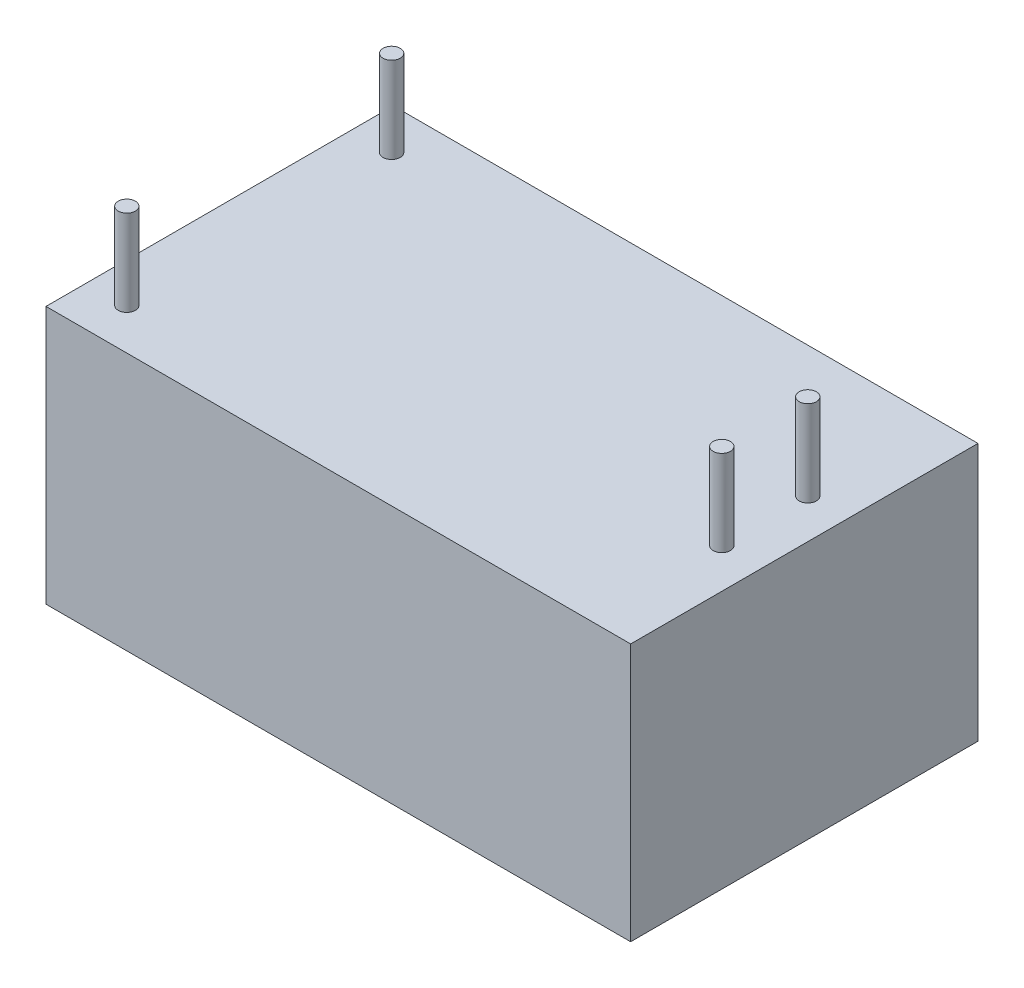
ISO-10303-21;
HEADER;
FILE_DESCRIPTION(('STEP AP214'),'2;1');
FILE_NAME('part.step','',(''),(''),'','','');
FILE_SCHEMA(('AUTOMOTIVE_DESIGN { 1 0 10303 214 1 1 1 1 }'));
ENDSEC;
DATA;
#1=APPLICATION_CONTEXT('core data for automotive mechanical design processes');
#2=APPLICATION_PROTOCOL_DEFINITION('international standard','automotive_design',2000,#1);
#3=PRODUCT_CONTEXT('',#1,'mechanical');
#4=PRODUCT('Part','Part','',(#3));
#5=PRODUCT_RELATED_PRODUCT_CATEGORY('part','',(#4));
#6=PRODUCT_DEFINITION_FORMATION('','',#4);
#7=PRODUCT_DEFINITION_CONTEXT('part definition',#1,'design');
#8=PRODUCT_DEFINITION('design','',#6,#7);
#9=PRODUCT_DEFINITION_SHAPE('','',#8);
#10=(LENGTH_UNIT() NAMED_UNIT(*) SI_UNIT(.MILLI.,.METRE.));
#11=(NAMED_UNIT(*) PLANE_ANGLE_UNIT() SI_UNIT($,.RADIAN.));
#12=(NAMED_UNIT(*) SI_UNIT($,.STERADIAN.) SOLID_ANGLE_UNIT());
#13=UNCERTAINTY_MEASURE_WITH_UNIT(LENGTH_MEASURE(1.E-05),#10,'distance_accuracy_value','');
#14=(GEOMETRIC_REPRESENTATION_CONTEXT(3) GLOBAL_UNCERTAINTY_ASSIGNED_CONTEXT((#13)) GLOBAL_UNIT_ASSIGNED_CONTEXT((#10,
#11,#12)) REPRESENTATION_CONTEXT('',''));
#15=CARTESIAN_POINT('',(0.,0.,0.));
#16=DIRECTION('',(0.,0.,1.));
#17=DIRECTION('',(1.,0.,0.));
#18=AXIS2_PLACEMENT_3D('',#15,#16,#17);
#19=CARTESIAN_POINT('',(17.,15.,10.1));
#20=DIRECTION('',(-1.,0.,0.));
#21=DIRECTION('',(0.,0.,1.));
#22=AXIS2_PLACEMENT_3D('',#19,#20,#21);
#23=PLANE('',#22);
#24=DIRECTION('',(0.,0.,-1.));
#25=VECTOR('',#24,1.);
#26=CARTESIAN_POINT('',(17.,0.,10.1));
#27=LINE('',#26,#25);
#28=CARTESIAN_POINT('',(17.,0.,10.1));
#29=VERTEX_POINT('',#28);
#30=CARTESIAN_POINT('',(17.,0.,-10.1));
#31=VERTEX_POINT('',#30);
#32=EDGE_CURVE('E101',#29,#31,#27,.T.);
#33=ORIENTED_EDGE('',*,*,#32,.T.);
#34=DIRECTION('',(0.,-1.,0.));
#35=VECTOR('',#34,1.);
#36=CARTESIAN_POINT('',(17.,15.,-10.1));
#37=LINE('',#36,#35);
#38=CARTESIAN_POINT('',(17.,15.,-10.1));
#39=VERTEX_POINT('',#38);
#40=EDGE_CURVE('E92',#39,#31,#37,.T.);
#41=ORIENTED_EDGE('',*,*,#40,.F.);
#42=DIRECTION('',(0.,0.,-1.));
#43=VECTOR('',#42,1.);
#44=CARTESIAN_POINT('',(17.,15.,10.1));
#45=LINE('',#44,#43);
#46=CARTESIAN_POINT('',(17.,15.,10.1));
#47=VERTEX_POINT('',#46);
#48=EDGE_CURVE('E86',#47,#39,#45,.T.);
#49=ORIENTED_EDGE('',*,*,#48,.F.);
#50=DIRECTION('',(0.,-1.,0.));
#51=VECTOR('',#50,1.);
#52=CARTESIAN_POINT('',(17.,15.,10.1));
#53=LINE('',#52,#51);
#54=EDGE_CURVE('E97',#47,#29,#53,.T.);
#55=ORIENTED_EDGE('',*,*,#54,.T.);
#56=EDGE_LOOP('',(#33,#41,#49,#55));
#57=FACE_BOUND('',#56,.T.);
#58=ADVANCED_FACE('F34',(#57),#23,.F.);
#59=CARTESIAN_POINT('',(-17.,15.,-10.1));
#60=DIRECTION('',(0.,0.,1.));
#61=DIRECTION('',(1.,0.,0.));
#62=AXIS2_PLACEMENT_3D('',#59,#60,#61);
#63=PLANE('',#62);
#64=DIRECTION('',(-1.,0.,0.));
#65=VECTOR('',#64,1.);
#66=CARTESIAN_POINT('',(-17.,0.,-10.1));
#67=LINE('',#66,#65);
#68=CARTESIAN_POINT('',(-17.,0.,-10.1));
#69=VERTEX_POINT('',#68);
#70=EDGE_CURVE('E91',#31,#69,#67,.T.);
#71=ORIENTED_EDGE('',*,*,#70,.T.);
#72=DIRECTION('',(0.,-1.,0.));
#73=VECTOR('',#72,1.);
#74=CARTESIAN_POINT('',(-17.,15.,-10.1));
#75=LINE('',#74,#73);
#76=CARTESIAN_POINT('',(-17.,15.,-10.1));
#77=VERTEX_POINT('',#76);
#78=EDGE_CURVE('E89',#77,#69,#75,.T.);
#79=ORIENTED_EDGE('',*,*,#78,.F.);
#80=DIRECTION('',(-1.,0.,0.));
#81=VECTOR('',#80,1.);
#82=CARTESIAN_POINT('',(-17.,15.,-10.1));
#83=LINE('',#82,#81);
#84=EDGE_CURVE('E81',#39,#77,#83,.T.);
#85=ORIENTED_EDGE('',*,*,#84,.F.);
#86=ORIENTED_EDGE('',*,*,#40,.T.);
#87=EDGE_LOOP('',(#71,#79,#85,#86));
#88=FACE_BOUND('',#87,.T.);
#89=ADVANCED_FACE('F90',(#88),#63,.F.);
#90=CARTESIAN_POINT('',(-17.,15.,10.1));
#91=DIRECTION('',(1.,0.,0.));
#92=DIRECTION('',(0.,0.,-1.));
#93=AXIS2_PLACEMENT_3D('',#90,#91,#92);
#94=PLANE('',#93);
#95=DIRECTION('',(0.,0.,1.));
#96=VECTOR('',#95,1.);
#97=CARTESIAN_POINT('',(-17.,0.,10.1));
#98=LINE('',#97,#96);
#99=CARTESIAN_POINT('',(-17.,0.,10.1));
#100=VERTEX_POINT('',#99);
#101=EDGE_CURVE('E67',#69,#100,#98,.T.);
#102=ORIENTED_EDGE('',*,*,#101,.T.);
#103=DIRECTION('',(0.,-1.,0.));
#104=VECTOR('',#103,1.);
#105=CARTESIAN_POINT('',(-17.,15.,10.1));
#106=LINE('',#105,#104);
#107=CARTESIAN_POINT('',(-17.,15.,10.1));
#108=VERTEX_POINT('',#107);
#109=EDGE_CURVE('E93',#108,#100,#106,.T.);
#110=ORIENTED_EDGE('',*,*,#109,.F.);
#111=DIRECTION('',(0.,0.,1.));
#112=VECTOR('',#111,1.);
#113=CARTESIAN_POINT('',(-17.,15.,10.1));
#114=LINE('',#113,#112);
#115=EDGE_CURVE('E84',#77,#108,#114,.T.);
#116=ORIENTED_EDGE('',*,*,#115,.F.);
#117=ORIENTED_EDGE('',*,*,#78,.T.);
#118=EDGE_LOOP('',(#102,#110,#116,#117));
#119=FACE_BOUND('',#118,.T.);
#120=ADVANCED_FACE('F95',(#119),#94,.F.);
#121=CARTESIAN_POINT('',(-17.,15.,10.1));
#122=DIRECTION('',(0.,0.,-1.));
#123=DIRECTION('',(-1.,0.,0.));
#124=AXIS2_PLACEMENT_3D('',#121,#122,#123);
#125=PLANE('',#124);
#126=DIRECTION('',(1.,0.,0.));
#127=VECTOR('',#126,1.);
#128=CARTESIAN_POINT('',(-17.,0.,10.1));
#129=LINE('',#128,#127);
#130=EDGE_CURVE('E73',#100,#29,#129,.T.);
#131=ORIENTED_EDGE('',*,*,#130,.T.);
#132=ORIENTED_EDGE('',*,*,#54,.F.);
#133=DIRECTION('',(1.,0.,0.));
#134=VECTOR('',#133,1.);
#135=CARTESIAN_POINT('',(-17.,15.,10.1));
#136=LINE('',#135,#134);
#137=EDGE_CURVE('E50',#108,#47,#136,.T.);
#138=ORIENTED_EDGE('',*,*,#137,.F.);
#139=ORIENTED_EDGE('',*,*,#109,.T.);
#140=EDGE_LOOP('',(#131,#132,#138,#139));
#141=FACE_BOUND('',#140,.T.);
#142=ADVANCED_FACE('F124',(#141),#125,.F.);
#143=CARTESIAN_POINT('',(0.,15.,0.));
#144=DIRECTION('',(0.,-1.,0.));
#145=DIRECTION('',(0.,0.,-1.));
#146=AXIS2_PLACEMENT_3D('',#143,#144,#145);
#147=PLANE('',#146);
#148=CARTESIAN_POINT('',(14.7,15.,-2.5));
#149=DIRECTION('',(0.,-1.,0.));
#150=DIRECTION('',(0.,0.,-1.));
#151=AXIS2_PLACEMENT_3D('',#148,#149,#150);
#152=CIRCLE('',#151,0.500000000000001);
#153=CARTESIAN_POINT('',(14.7,15.,-3.));
#154=VERTEX_POINT('',#153);
#155=EDGE_CURVE('E11',#154,#154,#152,.F.);
#156=ORIENTED_EDGE('',*,*,#155,.F.);
#157=EDGE_LOOP('',(#156));
#158=FACE_BOUND('',#157,.T.);
#159=CARTESIAN_POINT('',(14.7,15.,2.5));
#160=DIRECTION('',(0.,-1.,0.));
#161=DIRECTION('',(0.,0.,-1.));
#162=AXIS2_PLACEMENT_3D('',#159,#160,#161);
#163=CIRCLE('',#162,0.500000000000001);
#164=CARTESIAN_POINT('',(14.7,15.,2.));
#165=VERTEX_POINT('',#164);
#166=EDGE_CURVE('E42',#165,#165,#163,.F.);
#167=ORIENTED_EDGE('',*,*,#166,.F.);
#168=EDGE_LOOP('',(#167));
#169=FACE_BOUND('',#168,.T.);
#170=CARTESIAN_POINT('',(-14.7,15.,7.7));
#171=DIRECTION('',(0.,-1.,0.));
#172=DIRECTION('',(0.,0.,-1.));
#173=AXIS2_PLACEMENT_3D('',#170,#171,#172);
#174=CIRCLE('',#173,0.500000000000001);
#175=CARTESIAN_POINT('',(-14.7,15.,7.2));
#176=VERTEX_POINT('',#175);
#177=EDGE_CURVE('E114',#176,#176,#174,.F.);
#178=ORIENTED_EDGE('',*,*,#177,.F.);
#179=EDGE_LOOP('',(#178));
#180=FACE_BOUND('',#179,.T.);
#181=CARTESIAN_POINT('',(-14.7,15.,-7.7));
#182=DIRECTION('',(0.,-1.,0.));
#183=DIRECTION('',(0.,0.,-1.));
#184=AXIS2_PLACEMENT_3D('',#181,#182,#183);
#185=CIRCLE('',#184,0.500000000000001);
#186=CARTESIAN_POINT('',(-14.7,15.,-8.2));
#187=VERTEX_POINT('',#186);
#188=EDGE_CURVE('E111',#187,#187,#185,.F.);
#189=ORIENTED_EDGE('',*,*,#188,.F.);
#190=EDGE_LOOP('',(#189));
#191=FACE_BOUND('',#190,.T.);
#192=ORIENTED_EDGE('',*,*,#48,.T.);
#193=ORIENTED_EDGE('',*,*,#84,.T.);
#194=ORIENTED_EDGE('',*,*,#115,.T.);
#195=ORIENTED_EDGE('',*,*,#137,.T.);
#196=EDGE_LOOP('',(#192,#193,#194,#195));
#197=FACE_BOUND('',#196,.T.);
#198=ADVANCED_FACE('F82',(#158,#169,#180,#191,#197),#147,.F.);
#199=CARTESIAN_POINT('',(0.,0.,0.));
#200=DIRECTION('',(0.,-1.,0.));
#201=DIRECTION('',(0.,0.,-1.));
#202=AXIS2_PLACEMENT_3D('',#199,#200,#201);
#203=PLANE('',#202);
#204=ORIENTED_EDGE('',*,*,#32,.F.);
#205=ORIENTED_EDGE('',*,*,#130,.F.);
#206=ORIENTED_EDGE('',*,*,#101,.F.);
#207=ORIENTED_EDGE('',*,*,#70,.F.);
#208=EDGE_LOOP('',(#204,#205,#206,#207));
#209=FACE_BOUND('',#208,.T.);
#210=ADVANCED_FACE('F123',(#209),#203,.T.);
#211=CARTESIAN_POINT('',(-14.7,20.,-7.7));
#212=DIRECTION('',(0.,-1.,0.));
#213=DIRECTION('',(0.,0.,-1.));
#214=AXIS2_PLACEMENT_3D('',#211,#212,#213);
#215=CYLINDRICAL_SURFACE('',#214,0.500000000000001);
#216=CARTESIAN_POINT('',(-14.7,20.,-7.7));
#217=DIRECTION('',(0.,1.,0.));
#218=DIRECTION('',(0.,0.,1.));
#219=AXIS2_PLACEMENT_3D('',#216,#217,#218);
#220=CIRCLE('',#219,0.500000000000001);
#221=CARTESIAN_POINT('',(-14.7,20.,-7.2));
#222=VERTEX_POINT('',#221);
#223=EDGE_CURVE('E104',#222,#222,#220,.T.);
#224=ORIENTED_EDGE('',*,*,#223,.F.);
#225=EDGE_LOOP('',(#224));
#226=FACE_BOUND('',#225,.T.);
#227=ORIENTED_EDGE('',*,*,#188,.T.);
#228=EDGE_LOOP('',(#227));
#229=FACE_BOUND('',#228,.T.);
#230=ADVANCED_FACE('F131',(#226,#229),#215,.T.);
#231=CARTESIAN_POINT('',(-14.7,20.,-7.7));
#232=DIRECTION('',(0.,1.,0.));
#233=DIRECTION('',(0.,0.,1.));
#234=AXIS2_PLACEMENT_3D('',#231,#232,#233);
#235=PLANE('',#234);
#236=ORIENTED_EDGE('',*,*,#223,.T.);
#237=EDGE_LOOP('',(#236));
#238=FACE_BOUND('',#237,.T.);
#239=ADVANCED_FACE('F133',(#238),#235,.T.);
#240=CARTESIAN_POINT('',(-14.7,20.,7.7));
#241=DIRECTION('',(0.,-1.,0.));
#242=DIRECTION('',(0.,0.,-1.));
#243=AXIS2_PLACEMENT_3D('',#240,#241,#242);
#244=CYLINDRICAL_SURFACE('',#243,0.500000000000001);
#245=CARTESIAN_POINT('',(-14.7,20.,7.7));
#246=DIRECTION('',(0.,1.,0.));
#247=DIRECTION('',(0.,0.,1.));
#248=AXIS2_PLACEMENT_3D('',#245,#246,#247);
#249=CIRCLE('',#248,0.500000000000001);
#250=CARTESIAN_POINT('',(-14.7,20.,8.2));
#251=VERTEX_POINT('',#250);
#252=EDGE_CURVE('E262',#251,#251,#249,.T.);
#253=ORIENTED_EDGE('',*,*,#252,.F.);
#254=EDGE_LOOP('',(#253));
#255=FACE_BOUND('',#254,.T.);
#256=ORIENTED_EDGE('',*,*,#177,.T.);
#257=EDGE_LOOP('',(#256));
#258=FACE_BOUND('',#257,.T.);
#259=ADVANCED_FACE('F140',(#255,#258),#244,.T.);
#260=CARTESIAN_POINT('',(-14.7,20.,7.7));
#261=DIRECTION('',(0.,1.,0.));
#262=DIRECTION('',(0.,0.,1.));
#263=AXIS2_PLACEMENT_3D('',#260,#261,#262);
#264=PLANE('',#263);
#265=ORIENTED_EDGE('',*,*,#252,.T.);
#266=EDGE_LOOP('',(#265));
#267=FACE_BOUND('',#266,.T.);
#268=ADVANCED_FACE('F203',(#267),#264,.T.);
#269=CARTESIAN_POINT('',(14.7,20.,2.5));
#270=DIRECTION('',(0.,-1.,0.));
#271=DIRECTION('',(0.,0.,-1.));
#272=AXIS2_PLACEMENT_3D('',#269,#270,#271);
#273=CYLINDRICAL_SURFACE('',#272,0.500000000000001);
#274=CARTESIAN_POINT('',(14.7,20.,2.5));
#275=DIRECTION('',(0.,1.,0.));
#276=DIRECTION('',(0.,0.,1.));
#277=AXIS2_PLACEMENT_3D('',#274,#275,#276);
#278=CIRCLE('',#277,0.500000000000001);
#279=CARTESIAN_POINT('',(14.7,20.,3.));
#280=VERTEX_POINT('',#279);
#281=EDGE_CURVE('E259',#280,#280,#278,.T.);
#282=ORIENTED_EDGE('',*,*,#281,.F.);
#283=EDGE_LOOP('',(#282));
#284=FACE_BOUND('',#283,.T.);
#285=ORIENTED_EDGE('',*,*,#166,.T.);
#286=EDGE_LOOP('',(#285));
#287=FACE_BOUND('',#286,.T.);
#288=ADVANCED_FACE('F119',(#284,#287),#273,.T.);
#289=CARTESIAN_POINT('',(14.7,20.,2.5));
#290=DIRECTION('',(0.,1.,0.));
#291=DIRECTION('',(0.,0.,1.));
#292=AXIS2_PLACEMENT_3D('',#289,#290,#291);
#293=PLANE('',#292);
#294=ORIENTED_EDGE('',*,*,#281,.T.);
#295=EDGE_LOOP('',(#294));
#296=FACE_BOUND('',#295,.T.);
#297=ADVANCED_FACE('F220',(#296),#293,.T.);
#298=CARTESIAN_POINT('',(14.7,20.,-2.5));
#299=DIRECTION('',(0.,-1.,0.));
#300=DIRECTION('',(0.,0.,-1.));
#301=AXIS2_PLACEMENT_3D('',#298,#299,#300);
#302=CYLINDRICAL_SURFACE('',#301,0.500000000000001);
#303=CARTESIAN_POINT('',(14.7,20.,-2.5));
#304=DIRECTION('',(0.,1.,0.));
#305=DIRECTION('',(0.,0.,1.));
#306=AXIS2_PLACEMENT_3D('',#303,#304,#305);
#307=CIRCLE('',#306,0.500000000000001);
#308=CARTESIAN_POINT('',(14.7,20.,-2.));
#309=VERTEX_POINT('',#308);
#310=EDGE_CURVE('E258',#309,#309,#307,.T.);
#311=ORIENTED_EDGE('',*,*,#310,.F.);
#312=EDGE_LOOP('',(#311));
#313=FACE_BOUND('',#312,.T.);
#314=ORIENTED_EDGE('',*,*,#155,.T.);
#315=EDGE_LOOP('',(#314));
#316=FACE_BOUND('',#315,.T.);
#317=ADVANCED_FACE('F229',(#313,#316),#302,.T.);
#318=CARTESIAN_POINT('',(14.7,20.,-2.5));
#319=DIRECTION('',(0.,1.,0.));
#320=DIRECTION('',(0.,0.,1.));
#321=AXIS2_PLACEMENT_3D('',#318,#319,#320);
#322=PLANE('',#321);
#323=ORIENTED_EDGE('',*,*,#310,.T.);
#324=EDGE_LOOP('',(#323));
#325=FACE_BOUND('',#324,.T.);
#326=ADVANCED_FACE('F238',(#325),#322,.T.);
#327=CLOSED_SHELL('',(#58,#89,#120,#142,#198,#210,#230,#239,#259,#268,#288,#297,#317,#326));
#328=MANIFOLD_SOLID_BREP('B2',#327);
#329=ADVANCED_BREP_SHAPE_REPRESENTATION('',(#18,#328),#14);
#330=SHAPE_DEFINITION_REPRESENTATION(#9,#329);
ENDSEC;
END-ISO-10303-21;
